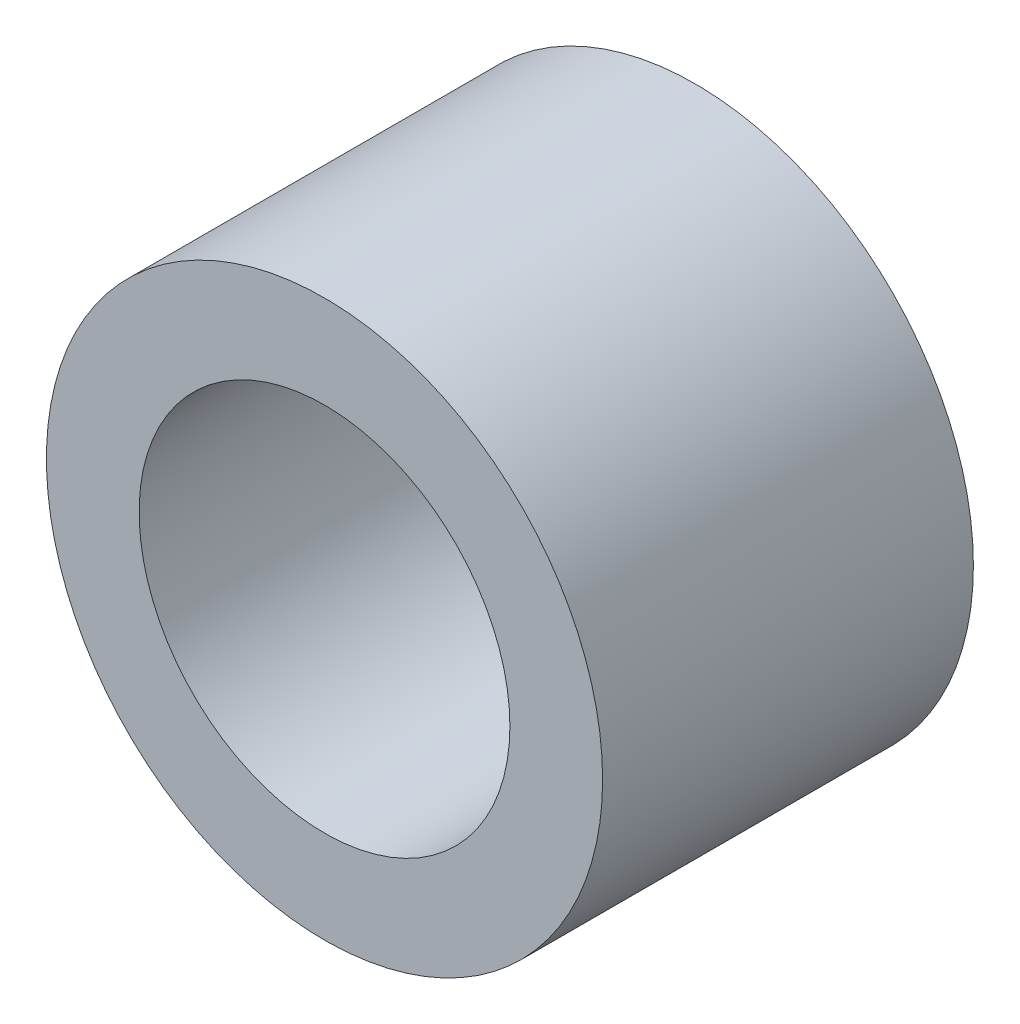
ISO-10303-21;
HEADER;
FILE_DESCRIPTION(('STEP AP214'),'2;1');
FILE_NAME('part.step','',(''),(''),'','','');
FILE_SCHEMA(('AUTOMOTIVE_DESIGN { 1 0 10303 214 1 1 1 1 }'));
ENDSEC;
DATA;
#1=APPLICATION_CONTEXT('core data for automotive mechanical design processes');
#2=APPLICATION_PROTOCOL_DEFINITION('international standard','automotive_design',2000,#1);
#3=PRODUCT_CONTEXT('',#1,'mechanical');
#4=PRODUCT('Part','Part','',(#3));
#5=PRODUCT_RELATED_PRODUCT_CATEGORY('part','',(#4));
#6=PRODUCT_DEFINITION_FORMATION('','',#4);
#7=PRODUCT_DEFINITION_CONTEXT('part definition',#1,'design');
#8=PRODUCT_DEFINITION('design','',#6,#7);
#9=PRODUCT_DEFINITION_SHAPE('','',#8);
#10=(LENGTH_UNIT() NAMED_UNIT(*) SI_UNIT(.MILLI.,.METRE.));
#11=(NAMED_UNIT(*) PLANE_ANGLE_UNIT() SI_UNIT($,.RADIAN.));
#12=(NAMED_UNIT(*) SI_UNIT($,.STERADIAN.) SOLID_ANGLE_UNIT());
#13=UNCERTAINTY_MEASURE_WITH_UNIT(LENGTH_MEASURE(1.E-05),#10,'distance_accuracy_value','');
#14=(GEOMETRIC_REPRESENTATION_CONTEXT(3) GLOBAL_UNCERTAINTY_ASSIGNED_CONTEXT((#13)) GLOBAL_UNIT_ASSIGNED_CONTEXT((#10,
#11,#12)) REPRESENTATION_CONTEXT('',''));
#15=CARTESIAN_POINT('',(0.,0.,0.));
#16=DIRECTION('',(0.,0.,1.));
#17=DIRECTION('',(1.,0.,0.));
#18=AXIS2_PLACEMENT_3D('',#15,#16,#17);
#19=CARTESIAN_POINT('',(0.,0.,10.));
#20=DIRECTION('',(0.,0.,1.));
#21=DIRECTION('',(1.,0.,0.));
#22=AXIS2_PLACEMENT_3D('',#19,#20,#21);
#23=PLANE('',#22);
#24=CARTESIAN_POINT('',(0.,0.,10.));
#25=DIRECTION('',(0.,0.,1.));
#26=DIRECTION('',(1.,0.,0.));
#27=AXIS2_PLACEMENT_3D('',#24,#25,#26);
#28=CIRCLE('',#27,7.5);
#29=CARTESIAN_POINT('',(7.5,0.,10.));
#30=VERTEX_POINT('',#29);
#31=EDGE_CURVE('E10',#30,#30,#28,.T.);
#32=ORIENTED_EDGE('',*,*,#31,.T.);
#33=EDGE_LOOP('',(#32));
#34=FACE_BOUND('',#33,.T.);
#35=CARTESIAN_POINT('',(0.,0.,10.));
#36=DIRECTION('',(0.,0.,1.));
#37=DIRECTION('',(1.,0.,0.));
#38=AXIS2_PLACEMENT_3D('',#35,#36,#37);
#39=CIRCLE('',#38,5.);
#40=CARTESIAN_POINT('',(5.,0.,10.));
#41=VERTEX_POINT('',#40);
#42=EDGE_CURVE('E42',#41,#41,#39,.T.);
#43=ORIENTED_EDGE('',*,*,#42,.F.);
#44=EDGE_LOOP('',(#43));
#45=FACE_BOUND('',#44,.T.);
#46=ADVANCED_FACE('F31',(#34,#45),#23,.T.);
#47=CARTESIAN_POINT('',(0.,0.,0.));
#48=DIRECTION('',(0.,0.,1.));
#49=DIRECTION('',(1.,0.,0.));
#50=AXIS2_PLACEMENT_3D('',#47,#48,#49);
#51=PLANE('',#50);
#52=CARTESIAN_POINT('',(0.,0.,0.));
#53=DIRECTION('',(0.,0.,1.));
#54=DIRECTION('',(1.,0.,0.));
#55=AXIS2_PLACEMENT_3D('',#52,#53,#54);
#56=CIRCLE('',#55,7.5);
#57=CARTESIAN_POINT('',(7.5,0.,0.));
#58=VERTEX_POINT('',#57);
#59=EDGE_CURVE('E35',#58,#58,#56,.T.);
#60=ORIENTED_EDGE('',*,*,#59,.F.);
#61=EDGE_LOOP('',(#60));
#62=FACE_BOUND('',#61,.T.);
#63=CARTESIAN_POINT('',(0.,0.,0.));
#64=DIRECTION('',(0.,0.,1.));
#65=DIRECTION('',(1.,0.,0.));
#66=AXIS2_PLACEMENT_3D('',#63,#64,#65);
#67=CIRCLE('',#66,5.);
#68=CARTESIAN_POINT('',(5.,0.,0.));
#69=VERTEX_POINT('',#68);
#70=EDGE_CURVE('E44',#69,#69,#67,.T.);
#71=ORIENTED_EDGE('',*,*,#70,.T.);
#72=EDGE_LOOP('',(#71));
#73=FACE_BOUND('',#72,.T.);
#74=ADVANCED_FACE('F54',(#62,#73),#51,.F.);
#75=CARTESIAN_POINT('',(0.,0.,10.));
#76=DIRECTION('',(0.,0.,-1.));
#77=DIRECTION('',(-1.,0.,0.));
#78=AXIS2_PLACEMENT_3D('',#75,#76,#77);
#79=CYLINDRICAL_SURFACE('',#78,7.5);
#80=ORIENTED_EDGE('',*,*,#31,.F.);
#81=EDGE_LOOP('',(#80));
#82=FACE_BOUND('',#81,.T.);
#83=ORIENTED_EDGE('',*,*,#59,.T.);
#84=EDGE_LOOP('',(#83));
#85=FACE_BOUND('',#84,.T.);
#86=ADVANCED_FACE('F33',(#82,#85),#79,.T.);
#87=CARTESIAN_POINT('',(0.,0.,10.));
#88=DIRECTION('',(0.,0.,-1.));
#89=DIRECTION('',(-1.,0.,0.));
#90=AXIS2_PLACEMENT_3D('',#87,#88,#89);
#91=CYLINDRICAL_SURFACE('',#90,5.);
#92=ORIENTED_EDGE('',*,*,#42,.T.);
#93=EDGE_LOOP('',(#92));
#94=FACE_BOUND('',#93,.T.);
#95=ORIENTED_EDGE('',*,*,#70,.F.);
#96=EDGE_LOOP('',(#95));
#97=FACE_BOUND('',#96,.T.);
#98=ADVANCED_FACE('F50',(#94,#97),#91,.F.);
#99=CLOSED_SHELL('',(#46,#74,#86,#98));
#100=MANIFOLD_SOLID_BREP('B2',#99);
#101=ADVANCED_BREP_SHAPE_REPRESENTATION('',(#18,#100),#14);
#102=SHAPE_DEFINITION_REPRESENTATION(#9,#101);
ENDSEC;
END-ISO-10303-21;
